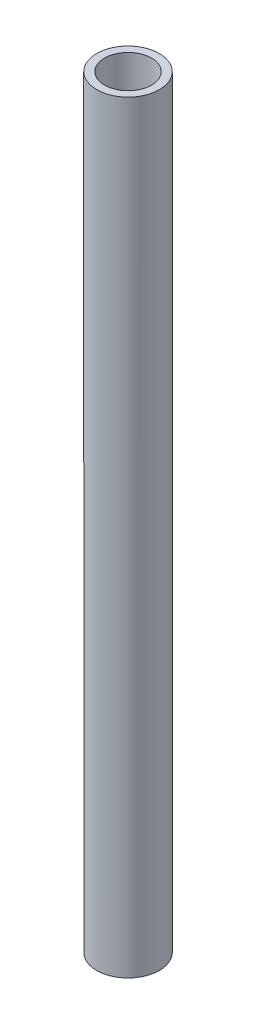
ISO-10303-21;
HEADER;
FILE_DESCRIPTION(('STEP AP214'),'2;1');
FILE_NAME('part.step','',(''),(''),'','','');
FILE_SCHEMA(('AUTOMOTIVE_DESIGN { 1 0 10303 214 1 1 1 1 }'));
ENDSEC;
DATA;
#1=APPLICATION_CONTEXT('core data for automotive mechanical design processes');
#2=APPLICATION_PROTOCOL_DEFINITION('international standard','automotive_design',2000,#1);
#3=PRODUCT_CONTEXT('',#1,'mechanical');
#4=PRODUCT('Part','Part','',(#3));
#5=PRODUCT_RELATED_PRODUCT_CATEGORY('part','',(#4));
#6=PRODUCT_DEFINITION_FORMATION('','',#4);
#7=PRODUCT_DEFINITION_CONTEXT('part definition',#1,'design');
#8=PRODUCT_DEFINITION('design','',#6,#7);
#9=PRODUCT_DEFINITION_SHAPE('','',#8);
#10=(LENGTH_UNIT() NAMED_UNIT(*) SI_UNIT(.MILLI.,.METRE.));
#11=(NAMED_UNIT(*) PLANE_ANGLE_UNIT() SI_UNIT($,.RADIAN.));
#12=(NAMED_UNIT(*) SI_UNIT($,.STERADIAN.) SOLID_ANGLE_UNIT());
#13=UNCERTAINTY_MEASURE_WITH_UNIT(LENGTH_MEASURE(1.E-05),#10,'distance_accuracy_value','');
#14=(GEOMETRIC_REPRESENTATION_CONTEXT(3) GLOBAL_UNCERTAINTY_ASSIGNED_CONTEXT((#13)) GLOBAL_UNIT_ASSIGNED_CONTEXT((#10,
#11,#12)) REPRESENTATION_CONTEXT('',''));
#15=CARTESIAN_POINT('',(0.,0.,0.));
#16=DIRECTION('',(0.,0.,1.));
#17=DIRECTION('',(1.,0.,0.));
#18=AXIS2_PLACEMENT_3D('',#15,#16,#17);
#19=CARTESIAN_POINT('',(0.,0.,0.));
#20=DIRECTION('',(0.,1.,0.));
#21=DIRECTION('',(0.,0.,1.));
#22=AXIS2_PLACEMENT_3D('',#19,#20,#21);
#23=PLANE('',#22);
#24=CARTESIAN_POINT('',(0.,0.,0.));
#25=DIRECTION('',(0.,1.,0.));
#26=DIRECTION('',(0.,0.,1.));
#27=AXIS2_PLACEMENT_3D('',#24,#25,#26);
#28=CIRCLE('',#27,4.);
#29=CARTESIAN_POINT('',(0.,0.,4.));
#30=VERTEX_POINT('',#29);
#31=EDGE_CURVE('E10',#30,#30,#28,.T.);
#32=ORIENTED_EDGE('',*,*,#31,.F.);
#33=EDGE_LOOP('',(#32));
#34=FACE_BOUND('',#33,.T.);
#35=CARTESIAN_POINT('',(0.,0.,0.));
#36=DIRECTION('',(0.,1.,0.));
#37=DIRECTION('',(0.,0.,1.));
#38=AXIS2_PLACEMENT_3D('',#35,#36,#37);
#39=CIRCLE('',#38,3.);
#40=CARTESIAN_POINT('',(0.,0.,3.));
#41=VERTEX_POINT('',#40);
#42=EDGE_CURVE('E43',#41,#41,#39,.T.);
#43=ORIENTED_EDGE('',*,*,#42,.T.);
#44=EDGE_LOOP('',(#43));
#45=FACE_BOUND('',#44,.T.);
#46=ADVANCED_FACE('F36',(#34,#45),#23,.F.);
#47=CARTESIAN_POINT('',(0.,270.,0.));
#48=DIRECTION('',(0.,-1.,0.));
#49=DIRECTION('',(0.,0.,-1.));
#50=AXIS2_PLACEMENT_3D('',#47,#48,#49);
#51=CYLINDRICAL_SURFACE('',#50,4.);
#52=CARTESIAN_POINT('',(0.,97.4478616442672,0.));
#53=DIRECTION('',(0.,-1.,0.));
#54=DIRECTION('',(1.,0.,0.));
#55=AXIS2_PLACEMENT_3D('',#52,#53,#54);
#56=CIRCLE('',#55,4.);
#57=CARTESIAN_POINT('',(4.,97.4478616442672,0.));
#58=VERTEX_POINT('',#57);
#59=EDGE_CURVE('E51',#58,#58,#56,.F.);
#60=ORIENTED_EDGE('',*,*,#59,.F.);
#61=EDGE_LOOP('',(#60));
#62=FACE_BOUND('',#61,.T.);
#63=ORIENTED_EDGE('',*,*,#31,.T.);
#64=EDGE_LOOP('',(#63));
#65=FACE_BOUND('',#64,.T.);
#66=ADVANCED_FACE('F38',(#62,#65),#51,.T.);
#67=CARTESIAN_POINT('',(0.,270.,0.));
#68=DIRECTION('',(0.,-1.,0.));
#69=DIRECTION('',(0.,0.,-1.));
#70=AXIS2_PLACEMENT_3D('',#67,#68,#69);
#71=CYLINDRICAL_SURFACE('',#70,3.);
#72=CARTESIAN_POINT('',(0.,97.4478616442672,0.));
#73=DIRECTION('',(0.,-1.,0.));
#74=DIRECTION('',(1.,0.,0.));
#75=AXIS2_PLACEMENT_3D('',#72,#73,#74);
#76=CIRCLE('',#75,3.);
#77=CARTESIAN_POINT('',(3.,97.4478616442672,0.));
#78=VERTEX_POINT('',#77);
#79=EDGE_CURVE('E47',#78,#78,#76,.F.);
#80=ORIENTED_EDGE('',*,*,#79,.T.);
#81=EDGE_LOOP('',(#80));
#82=FACE_BOUND('',#81,.T.);
#83=ORIENTED_EDGE('',*,*,#42,.F.);
#84=EDGE_LOOP('',(#83));
#85=FACE_BOUND('',#84,.T.);
#86=ADVANCED_FACE('F61',(#82,#85),#71,.F.);
#87=CARTESIAN_POINT('',(-52.8604140297689,97.4478616442672,59.7869234715902));
#88=DIRECTION('',(0.,-1.,0.));
#89=DIRECTION('',(0.836999079326659,0.,-0.547204295676053));
#90=AXIS2_PLACEMENT_3D('',#87,#88,#89);
#91=PLANE('',#90);
#92=ORIENTED_EDGE('',*,*,#59,.T.);
#93=EDGE_LOOP('',(#92));
#94=FACE_BOUND('',#93,.T.);
#95=ORIENTED_EDGE('',*,*,#79,.F.);
#96=EDGE_LOOP('',(#95));
#97=FACE_BOUND('',#96,.T.);
#98=ADVANCED_FACE('F57',(#94,#97),#91,.F.);
#99=CLOSED_SHELL('',(#46,#66,#86,#98));
#100=MANIFOLD_SOLID_BREP('B2',#99);
#101=ADVANCED_BREP_SHAPE_REPRESENTATION('',(#18,#100),#14);
#102=SHAPE_DEFINITION_REPRESENTATION(#9,#101);
ENDSEC;
END-ISO-10303-21;
